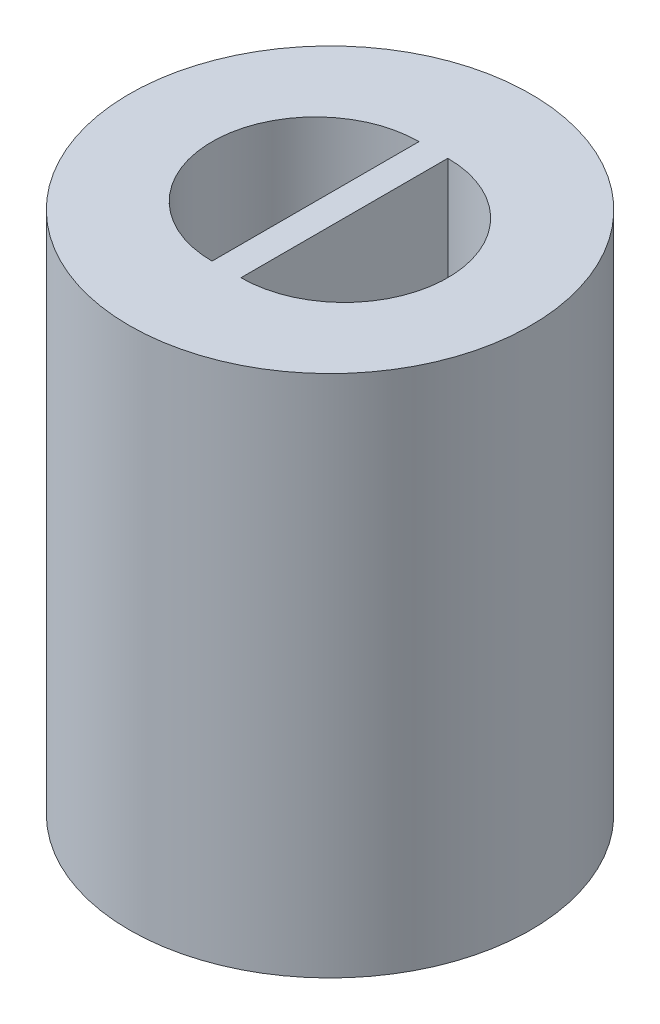
ISO-10303-21;
HEADER;
FILE_DESCRIPTION(('STEP AP214'),'2;1');
FILE_NAME('part.step','',(''),(''),'','','');
FILE_SCHEMA(('AUTOMOTIVE_DESIGN { 1 0 10303 214 1 1 1 1 }'));
ENDSEC;
DATA;
#1=APPLICATION_CONTEXT('core data for automotive mechanical design processes');
#2=APPLICATION_PROTOCOL_DEFINITION('international standard','automotive_design',2000,#1);
#3=PRODUCT_CONTEXT('',#1,'mechanical');
#4=PRODUCT('Part','Part','',(#3));
#5=PRODUCT_RELATED_PRODUCT_CATEGORY('part','',(#4));
#6=PRODUCT_DEFINITION_FORMATION('','',#4);
#7=PRODUCT_DEFINITION_CONTEXT('part definition',#1,'design');
#8=PRODUCT_DEFINITION('design','',#6,#7);
#9=PRODUCT_DEFINITION_SHAPE('','',#8);
#10=(LENGTH_UNIT() NAMED_UNIT(*) SI_UNIT(.MILLI.,.METRE.));
#11=(NAMED_UNIT(*) PLANE_ANGLE_UNIT() SI_UNIT($,.RADIAN.));
#12=(NAMED_UNIT(*) SI_UNIT($,.STERADIAN.) SOLID_ANGLE_UNIT());
#13=UNCERTAINTY_MEASURE_WITH_UNIT(LENGTH_MEASURE(1.E-05),#10,'distance_accuracy_value','');
#14=(GEOMETRIC_REPRESENTATION_CONTEXT(3) GLOBAL_UNCERTAINTY_ASSIGNED_CONTEXT((#13)) GLOBAL_UNIT_ASSIGNED_CONTEXT((#10,
#11,#12)) REPRESENTATION_CONTEXT('',''));
#15=CARTESIAN_POINT('',(0.,0.,0.));
#16=DIRECTION('',(0.,0.,1.));
#17=DIRECTION('',(1.,0.,0.));
#18=AXIS2_PLACEMENT_3D('',#15,#16,#17);
#19=CARTESIAN_POINT('',(0.,0.,0.));
#20=DIRECTION('',(0.,1.,0.));
#21=DIRECTION('',(0.,0.,1.));
#22=AXIS2_PLACEMENT_3D('',#19,#20,#21);
#23=PLANE('',#22);
#24=CARTESIAN_POINT('',(0.,0.,0.));
#25=DIRECTION('',(0.,1.,0.));
#26=DIRECTION('',(0.,0.,1.));
#27=AXIS2_PLACEMENT_3D('',#24,#25,#26);
#28=CIRCLE('',#27,5.75);
#29=CARTESIAN_POINT('',(0.,0.,5.75));
#30=VERTEX_POINT('',#29);
#31=EDGE_CURVE('E43',#30,#30,#28,.T.);
#32=ORIENTED_EDGE('',*,*,#31,.F.);
#33=EDGE_LOOP('',(#32));
#34=FACE_BOUND('',#33,.T.);
#35=DIRECTION('',(0.,0.,-1.));
#36=VECTOR('',#35,1.);
#37=CARTESIAN_POINT('',(1.85,0.,-2.75));
#38=LINE('',#37,#36);
#39=CARTESIAN_POINT('',(1.85,0.,2.75));
#40=VERTEX_POINT('',#39);
#41=CARTESIAN_POINT('',(1.85,0.,-2.75));
#42=VERTEX_POINT('',#41);
#43=EDGE_CURVE('E55',#40,#42,#38,.T.);
#44=ORIENTED_EDGE('',*,*,#43,.T.);
#45=DIRECTION('',(-1.,0.,0.));
#46=VECTOR('',#45,1.);
#47=CARTESIAN_POINT('',(-1.85,0.,-2.75));
#48=LINE('',#47,#46);
#49=CARTESIAN_POINT('',(-1.85,0.,-2.75));
#50=VERTEX_POINT('',#49);
#51=EDGE_CURVE('E126',#42,#50,#48,.T.);
#52=ORIENTED_EDGE('',*,*,#51,.T.);
#53=DIRECTION('',(0.,0.,1.));
#54=VECTOR('',#53,1.);
#55=CARTESIAN_POINT('',(-1.85,0.,-2.75));
#56=LINE('',#55,#54);
#57=CARTESIAN_POINT('',(-1.85,0.,2.75));
#58=VERTEX_POINT('',#57);
#59=EDGE_CURVE('E306',#50,#58,#56,.T.);
#60=ORIENTED_EDGE('',*,*,#59,.T.);
#61=DIRECTION('',(1.,0.,0.));
#62=VECTOR('',#61,1.);
#63=CARTESIAN_POINT('',(-1.85,0.,2.75));
#64=LINE('',#63,#62);
#65=EDGE_CURVE('E122',#58,#40,#64,.T.);
#66=ORIENTED_EDGE('',*,*,#65,.T.);
#67=EDGE_LOOP('',(#44,#52,#60,#66));
#68=FACE_BOUND('',#67,.T.);
#69=ADVANCED_FACE('F39',(#34,#68),#23,.F.);
#70=CARTESIAN_POINT('',(0.,15.,0.));
#71=DIRECTION('',(0.,-1.,0.));
#72=DIRECTION('',(0.,0.,-1.));
#73=AXIS2_PLACEMENT_3D('',#70,#71,#72);
#74=CYLINDRICAL_SURFACE('',#73,5.75);
#75=CARTESIAN_POINT('',(0.,15.,0.));
#76=DIRECTION('',(0.,1.,0.));
#77=DIRECTION('',(0.,0.,1.));
#78=AXIS2_PLACEMENT_3D('',#75,#76,#77);
#79=CIRCLE('',#78,5.75);
#80=CARTESIAN_POINT('',(0.,15.,5.75));
#81=VERTEX_POINT('',#80);
#82=EDGE_CURVE('E11',#81,#81,#79,.T.);
#83=ORIENTED_EDGE('',*,*,#82,.F.);
#84=EDGE_LOOP('',(#83));
#85=FACE_BOUND('',#84,.T.);
#86=ORIENTED_EDGE('',*,*,#31,.T.);
#87=EDGE_LOOP('',(#86));
#88=FACE_BOUND('',#87,.T.);
#89=ADVANCED_FACE('F41',(#85,#88),#74,.T.);
#90=CARTESIAN_POINT('',(0.,15.,0.));
#91=DIRECTION('',(0.,1.,0.));
#92=DIRECTION('',(0.,0.,1.));
#93=AXIS2_PLACEMENT_3D('',#90,#91,#92);
#94=PLANE('',#93);
#95=CARTESIAN_POINT('',(0.41,15.,0.));
#96=DIRECTION('',(0.,1.,0.));
#97=DIRECTION('',(0.,0.,-1.));
#98=AXIS2_PLACEMENT_3D('',#95,#96,#97);
#99=CIRCLE('',#98,2.96467159946198);
#100=CARTESIAN_POINT('',(0.41,15.,2.96467159946198));
#101=VERTEX_POINT('',#100);
#102=CARTESIAN_POINT('',(0.41,15.,-2.96467159946198));
#103=VERTEX_POINT('',#102);
#104=EDGE_CURVE('E63',#101,#103,#99,.T.);
#105=ORIENTED_EDGE('',*,*,#104,.F.);
#106=DIRECTION('',(0.,0.,1.));
#107=VECTOR('',#106,1.);
#108=CARTESIAN_POINT('',(0.41,15.,-2.96467159946198));
#109=LINE('',#108,#107);
#110=EDGE_CURVE('E144',#103,#101,#109,.T.);
#111=ORIENTED_EDGE('',*,*,#110,.F.);
#112=EDGE_LOOP('',(#105,#111));
#113=FACE_BOUND('',#112,.T.);
#114=CARTESIAN_POINT('',(-0.416408681207295,15.,0.));
#115=DIRECTION('',(0.,1.,0.));
#116=DIRECTION('',(0.,0.,1.));
#117=AXIS2_PLACEMENT_3D('',#114,#115,#116);
#118=CIRCLE('',#117,2.96556468188459);
#119=CARTESIAN_POINT('',(-0.416408681207295,15.,-2.96556468188459));
#120=VERTEX_POINT('',#119);
#121=CARTESIAN_POINT('',(-0.416408681207294,15.,2.96556468188459));
#122=VERTEX_POINT('',#121);
#123=EDGE_CURVE('E128',#120,#122,#118,.T.);
#124=ORIENTED_EDGE('',*,*,#123,.F.);
#125=DIRECTION('',(0.,0.,-1.));
#126=VECTOR('',#125,1.);
#127=CARTESIAN_POINT('',(-0.416408681207295,15.,-2.96556468188459));
#128=LINE('',#127,#126);
#129=EDGE_CURVE('E133',#122,#120,#128,.T.);
#130=ORIENTED_EDGE('',*,*,#129,.F.);
#131=EDGE_LOOP('',(#124,#130));
#132=FACE_BOUND('',#131,.T.);
#133=ORIENTED_EDGE('',*,*,#82,.T.);
#134=EDGE_LOOP('',(#133));
#135=FACE_BOUND('',#134,.T.);
#136=ADVANCED_FACE('F184',(#113,#132,#135),#94,.T.);
#137=CARTESIAN_POINT('',(-0.416408681207295,7.,0.));
#138=DIRECTION('',(0.,1.,0.));
#139=DIRECTION('',(0.,0.,1.));
#140=AXIS2_PLACEMENT_3D('',#137,#138,#139);
#141=CYLINDRICAL_SURFACE('',#140,2.96556468188459);
#142=ORIENTED_EDGE('',*,*,#123,.T.);
#143=DIRECTION('',(0.,1.,0.));
#144=VECTOR('',#143,1.);
#145=CARTESIAN_POINT('',(-0.416408681207294,7.,2.96556468188459));
#146=LINE('',#145,#144);
#147=CARTESIAN_POINT('',(-0.416408681207294,7.,2.96556468188459));
#148=VERTEX_POINT('',#147);
#149=EDGE_CURVE('E167',#148,#122,#146,.T.);
#150=ORIENTED_EDGE('',*,*,#149,.F.);
#151=CARTESIAN_POINT('',(-0.416408681207295,7.,0.));
#152=DIRECTION('',(0.,1.,0.));
#153=DIRECTION('',(0.,0.,1.));
#154=AXIS2_PLACEMENT_3D('',#151,#152,#153);
#155=CIRCLE('',#154,2.96556468188459);
#156=CARTESIAN_POINT('',(-0.416408681207295,7.,-2.96556468188459));
#157=VERTEX_POINT('',#156);
#158=EDGE_CURVE('E160',#157,#148,#155,.T.);
#159=ORIENTED_EDGE('',*,*,#158,.F.);
#160=DIRECTION('',(0.,1.,0.));
#161=VECTOR('',#160,1.);
#162=CARTESIAN_POINT('',(-0.416408681207295,7.,-2.96556468188459));
#163=LINE('',#162,#161);
#164=EDGE_CURVE('E151',#157,#120,#163,.T.);
#165=ORIENTED_EDGE('',*,*,#164,.T.);
#166=EDGE_LOOP('',(#142,#150,#159,#165));
#167=FACE_BOUND('',#166,.T.);
#168=ADVANCED_FACE('F186',(#167),#141,.F.);
#169=CARTESIAN_POINT('',(-0.416408681207295,7.,-2.96556468188459));
#170=DIRECTION('',(1.,0.,0.));
#171=DIRECTION('',(0.,0.,-1.));
#172=AXIS2_PLACEMENT_3D('',#169,#170,#171);
#173=PLANE('',#172);
#174=ORIENTED_EDGE('',*,*,#129,.T.);
#175=ORIENTED_EDGE('',*,*,#164,.F.);
#176=DIRECTION('',(0.,0.,-1.));
#177=VECTOR('',#176,1.);
#178=CARTESIAN_POINT('',(-0.416408681207295,7.,-2.96556468188459));
#179=LINE('',#178,#177);
#180=EDGE_CURVE('E164',#148,#157,#179,.T.);
#181=ORIENTED_EDGE('',*,*,#180,.F.);
#182=ORIENTED_EDGE('',*,*,#149,.T.);
#183=EDGE_LOOP('',(#174,#175,#181,#182));
#184=FACE_BOUND('',#183,.T.);
#185=ADVANCED_FACE('F179',(#184),#173,.F.);
#186=CARTESIAN_POINT('',(-0.416408681207295,7.,0.));
#187=DIRECTION('',(0.,1.,0.));
#188=DIRECTION('',(0.,0.,1.));
#189=AXIS2_PLACEMENT_3D('',#186,#187,#188);
#190=PLANE('',#189);
#191=ORIENTED_EDGE('',*,*,#158,.T.);
#192=ORIENTED_EDGE('',*,*,#180,.T.);
#193=EDGE_LOOP('',(#191,#192));
#194=FACE_BOUND('',#193,.T.);
#195=ADVANCED_FACE('F188',(#194),#190,.T.);
#196=CARTESIAN_POINT('',(0.41,7.,0.));
#197=DIRECTION('',(0.,1.,0.));
#198=DIRECTION('',(0.,0.,1.));
#199=AXIS2_PLACEMENT_3D('',#196,#197,#198);
#200=CYLINDRICAL_SURFACE('',#199,2.96467159946198);
#201=ORIENTED_EDGE('',*,*,#104,.T.);
#202=DIRECTION('',(0.,1.,0.));
#203=VECTOR('',#202,1.);
#204=CARTESIAN_POINT('',(0.41,7.,-2.96467159946198));
#205=LINE('',#204,#203);
#206=CARTESIAN_POINT('',(0.41,7.,-2.96467159946198));
#207=VERTEX_POINT('',#206);
#208=EDGE_CURVE('E148',#207,#103,#205,.T.);
#209=ORIENTED_EDGE('',*,*,#208,.F.);
#210=CARTESIAN_POINT('',(0.41,7.,0.));
#211=DIRECTION('',(0.,1.,0.));
#212=DIRECTION('',(0.,0.,-1.));
#213=AXIS2_PLACEMENT_3D('',#210,#211,#212);
#214=CIRCLE('',#213,2.96467159946198);
#215=CARTESIAN_POINT('',(0.41,7.,2.96467159946198));
#216=VERTEX_POINT('',#215);
#217=EDGE_CURVE('E139',#216,#207,#214,.T.);
#218=ORIENTED_EDGE('',*,*,#217,.F.);
#219=DIRECTION('',(0.,1.,0.));
#220=VECTOR('',#219,1.);
#221=CARTESIAN_POINT('',(0.41,7.,2.96467159946198));
#222=LINE('',#221,#220);
#223=EDGE_CURVE('E155',#216,#101,#222,.T.);
#224=ORIENTED_EDGE('',*,*,#223,.T.);
#225=EDGE_LOOP('',(#201,#209,#218,#224));
#226=FACE_BOUND('',#225,.T.);
#227=ADVANCED_FACE('F190',(#226),#200,.F.);
#228=CARTESIAN_POINT('',(0.41,7.,-2.96467159946198));
#229=DIRECTION('',(-1.,0.,0.));
#230=DIRECTION('',(0.,0.,1.));
#231=AXIS2_PLACEMENT_3D('',#228,#229,#230);
#232=PLANE('',#231);
#233=ORIENTED_EDGE('',*,*,#110,.T.);
#234=ORIENTED_EDGE('',*,*,#223,.F.);
#235=DIRECTION('',(0.,0.,1.));
#236=VECTOR('',#235,1.);
#237=CARTESIAN_POINT('',(0.41,7.,-2.96467159946198));
#238=LINE('',#237,#236);
#239=EDGE_CURVE('E143',#207,#216,#238,.T.);
#240=ORIENTED_EDGE('',*,*,#239,.F.);
#241=ORIENTED_EDGE('',*,*,#208,.T.);
#242=EDGE_LOOP('',(#233,#234,#240,#241));
#243=FACE_BOUND('',#242,.T.);
#244=ADVANCED_FACE('F196',(#243),#232,.F.);
#245=CARTESIAN_POINT('',(0.41,7.,0.));
#246=DIRECTION('',(0.,-1.,0.));
#247=DIRECTION('',(0.,0.,-1.));
#248=AXIS2_PLACEMENT_3D('',#245,#246,#247);
#249=PLANE('',#248);
#250=ORIENTED_EDGE('',*,*,#217,.T.);
#251=ORIENTED_EDGE('',*,*,#239,.T.);
#252=EDGE_LOOP('',(#250,#251));
#253=FACE_BOUND('',#252,.T.);
#254=ADVANCED_FACE('F239',(#253),#249,.F.);
#255=CARTESIAN_POINT('',(1.85,6.5,-2.75));
#256=DIRECTION('',(-1.,0.,0.));
#257=DIRECTION('',(0.,0.,1.));
#258=AXIS2_PLACEMENT_3D('',#255,#256,#257);
#259=PLANE('',#258);
#260=ORIENTED_EDGE('',*,*,#43,.F.);
#261=DIRECTION('',(0.,-1.,0.));
#262=VECTOR('',#261,1.);
#263=CARTESIAN_POINT('',(1.85,6.5,2.75));
#264=LINE('',#263,#262);
#265=CARTESIAN_POINT('',(1.85,6.5,2.75));
#266=VERTEX_POINT('',#265);
#267=EDGE_CURVE('E120',#266,#40,#264,.T.);
#268=ORIENTED_EDGE('',*,*,#267,.F.);
#269=DIRECTION('',(0.,0.,-1.));
#270=VECTOR('',#269,1.);
#271=CARTESIAN_POINT('',(1.85,6.5,-2.75));
#272=LINE('',#271,#270);
#273=CARTESIAN_POINT('',(1.85,6.5,-2.75));
#274=VERTEX_POINT('',#273);
#275=EDGE_CURVE('E111',#266,#274,#272,.T.);
#276=ORIENTED_EDGE('',*,*,#275,.T.);
#277=DIRECTION('',(0.,-1.,0.));
#278=VECTOR('',#277,1.);
#279=CARTESIAN_POINT('',(1.85,6.5,-2.75));
#280=LINE('',#279,#278);
#281=EDGE_CURVE('E119',#274,#42,#280,.T.);
#282=ORIENTED_EDGE('',*,*,#281,.T.);
#283=EDGE_LOOP('',(#260,#268,#276,#282));
#284=FACE_BOUND('',#283,.T.);
#285=ADVANCED_FACE('F118',(#284),#259,.T.);
#286=CARTESIAN_POINT('',(-1.85,6.5,-2.75));
#287=DIRECTION('',(0.,0.,1.));
#288=DIRECTION('',(1.,0.,0.));
#289=AXIS2_PLACEMENT_3D('',#286,#287,#288);
#290=PLANE('',#289);
#291=ORIENTED_EDGE('',*,*,#51,.F.);
#292=ORIENTED_EDGE('',*,*,#281,.F.);
#293=DIRECTION('',(-1.,0.,0.));
#294=VECTOR('',#293,1.);
#295=CARTESIAN_POINT('',(-1.85,6.5,-2.75));
#296=LINE('',#295,#294);
#297=CARTESIAN_POINT('',(-1.85,6.5,-2.75));
#298=VERTEX_POINT('',#297);
#299=EDGE_CURVE('E107',#274,#298,#296,.T.);
#300=ORIENTED_EDGE('',*,*,#299,.T.);
#301=DIRECTION('',(0.,-1.,0.));
#302=VECTOR('',#301,1.);
#303=CARTESIAN_POINT('',(-1.85,6.5,-2.75));
#304=LINE('',#303,#302);
#305=EDGE_CURVE('E129',#298,#50,#304,.T.);
#306=ORIENTED_EDGE('',*,*,#305,.T.);
#307=EDGE_LOOP('',(#291,#292,#300,#306));
#308=FACE_BOUND('',#307,.T.);
#309=ADVANCED_FACE('F124',(#308),#290,.T.);
#310=CARTESIAN_POINT('',(-1.85,6.5,-2.75));
#311=DIRECTION('',(1.,0.,0.));
#312=DIRECTION('',(0.,0.,-1.));
#313=AXIS2_PLACEMENT_3D('',#310,#311,#312);
#314=PLANE('',#313);
#315=ORIENTED_EDGE('',*,*,#59,.F.);
#316=ORIENTED_EDGE('',*,*,#305,.F.);
#317=DIRECTION('',(0.,0.,1.));
#318=VECTOR('',#317,1.);
#319=CARTESIAN_POINT('',(-1.85,6.5,-2.75));
#320=LINE('',#319,#318);
#321=CARTESIAN_POINT('',(-1.85,6.5,2.75));
#322=VERTEX_POINT('',#321);
#323=EDGE_CURVE('E112',#298,#322,#320,.T.);
#324=ORIENTED_EDGE('',*,*,#323,.T.);
#325=DIRECTION('',(0.,-1.,0.));
#326=VECTOR('',#325,1.);
#327=CARTESIAN_POINT('',(-1.85,6.5,2.75));
#328=LINE('',#327,#326);
#329=EDGE_CURVE('E135',#322,#58,#328,.T.);
#330=ORIENTED_EDGE('',*,*,#329,.T.);
#331=EDGE_LOOP('',(#315,#316,#324,#330));
#332=FACE_BOUND('',#331,.T.);
#333=ADVANCED_FACE('F270',(#332),#314,.T.);
#334=CARTESIAN_POINT('',(-1.85,6.5,2.75));
#335=DIRECTION('',(0.,0.,-1.));
#336=DIRECTION('',(-1.,0.,0.));
#337=AXIS2_PLACEMENT_3D('',#334,#335,#336);
#338=PLANE('',#337);
#339=ORIENTED_EDGE('',*,*,#65,.F.);
#340=ORIENTED_EDGE('',*,*,#329,.F.);
#341=DIRECTION('',(1.,0.,0.));
#342=VECTOR('',#341,1.);
#343=CARTESIAN_POINT('',(-1.85,6.5,2.75));
#344=LINE('',#343,#342);
#345=EDGE_CURVE('E316',#322,#266,#344,.T.);
#346=ORIENTED_EDGE('',*,*,#345,.T.);
#347=ORIENTED_EDGE('',*,*,#267,.T.);
#348=EDGE_LOOP('',(#339,#340,#346,#347));
#349=FACE_BOUND('',#348,.T.);
#350=ADVANCED_FACE('F279',(#349),#338,.T.);
#351=CARTESIAN_POINT('',(0.,6.5,0.));
#352=DIRECTION('',(0.,1.,0.));
#353=DIRECTION('',(0.,0.,1.));
#354=AXIS2_PLACEMENT_3D('',#351,#352,#353);
#355=PLANE('',#354);
#356=ORIENTED_EDGE('',*,*,#275,.F.);
#357=ORIENTED_EDGE('',*,*,#345,.F.);
#358=ORIENTED_EDGE('',*,*,#323,.F.);
#359=ORIENTED_EDGE('',*,*,#299,.F.);
#360=EDGE_LOOP('',(#356,#357,#358,#359));
#361=FACE_BOUND('',#360,.T.);
#362=ADVANCED_FACE('F109',(#361),#355,.F.);
#363=CLOSED_SHELL('',(#69,#89,#136,#168,#185,#195,#227,#244,#254,#285,#309,#333,#350,#362));
#364=MANIFOLD_SOLID_BREP('B2',#363);
#365=ADVANCED_BREP_SHAPE_REPRESENTATION('',(#18,#364),#14);
#366=SHAPE_DEFINITION_REPRESENTATION(#9,#365);
ENDSEC;
END-ISO-10303-21;
